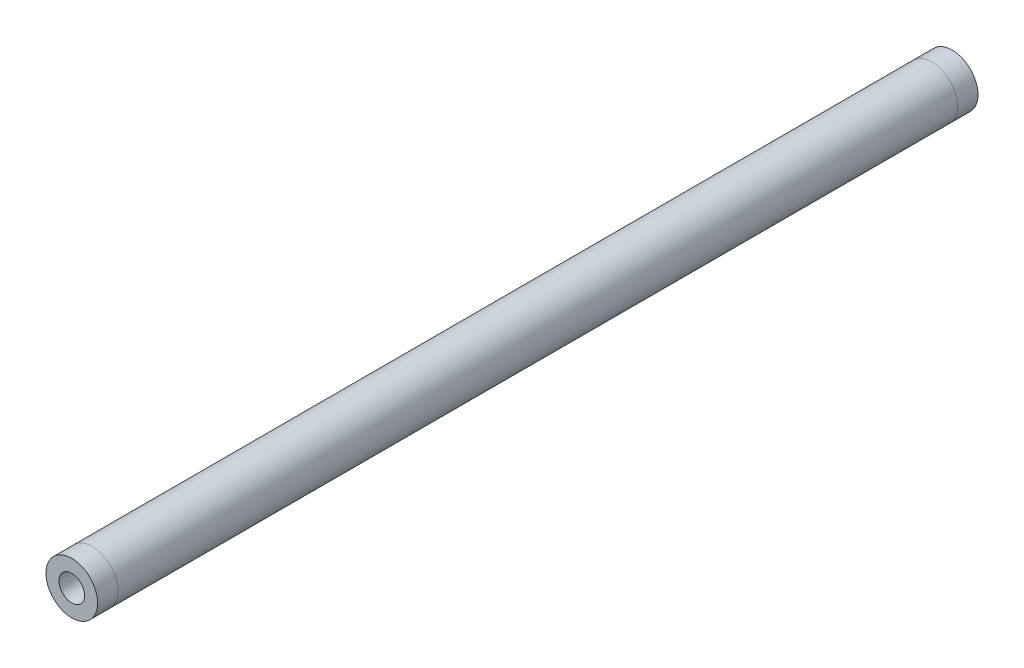
ISO-10303-21;
HEADER;
FILE_DESCRIPTION(('STEP AP214'),'2;1');
FILE_NAME('part.step','',(''),(''),'','','');
FILE_SCHEMA(('AUTOMOTIVE_DESIGN { 1 0 10303 214 1 1 1 1 }'));
ENDSEC;
DATA;
#1=APPLICATION_CONTEXT('core data for automotive mechanical design processes');
#2=APPLICATION_PROTOCOL_DEFINITION('international standard','automotive_design',2000,#1);
#3=PRODUCT_CONTEXT('',#1,'mechanical');
#4=PRODUCT('Part','Part','',(#3));
#5=PRODUCT_RELATED_PRODUCT_CATEGORY('part','',(#4));
#6=PRODUCT_DEFINITION_FORMATION('','',#4);
#7=PRODUCT_DEFINITION_CONTEXT('part definition',#1,'design');
#8=PRODUCT_DEFINITION('design','',#6,#7);
#9=PRODUCT_DEFINITION_SHAPE('','',#8);
#10=(LENGTH_UNIT() NAMED_UNIT(*) SI_UNIT(.MILLI.,.METRE.));
#11=(NAMED_UNIT(*) PLANE_ANGLE_UNIT() SI_UNIT($,.RADIAN.));
#12=(NAMED_UNIT(*) SI_UNIT($,.STERADIAN.) SOLID_ANGLE_UNIT());
#13=UNCERTAINTY_MEASURE_WITH_UNIT(LENGTH_MEASURE(1.E-05),#10,'distance_accuracy_value','');
#14=(GEOMETRIC_REPRESENTATION_CONTEXT(3) GLOBAL_UNCERTAINTY_ASSIGNED_CONTEXT((#13)) GLOBAL_UNIT_ASSIGNED_CONTEXT((#10,
#11,#12)) REPRESENTATION_CONTEXT('',''));
#15=CARTESIAN_POINT('',(0.,0.,0.));
#16=DIRECTION('',(0.,0.,1.));
#17=DIRECTION('',(1.,0.,0.));
#18=AXIS2_PLACEMENT_3D('',#15,#16,#17);
#19=CARTESIAN_POINT('',(0.,0.,-272.761985678966));
#20=DIRECTION('',(0.,0.,1.));
#21=DIRECTION('',(1.,0.,0.));
#22=AXIS2_PLACEMENT_3D('',#19,#20,#21);
#23=CYLINDRICAL_SURFACE('',#22,8.001);
#24=CARTESIAN_POINT('',(0.,0.,-272.761985678966));
#25=DIRECTION('',(0.,0.,1.));
#26=DIRECTION('',(1.,0.,0.));
#27=AXIS2_PLACEMENT_3D('',#24,#25,#26);
#28=CIRCLE('',#27,8.001);
#29=CARTESIAN_POINT('',(8.001,0.,-272.761985678966));
#30=VERTEX_POINT('',#29);
#31=EDGE_CURVE('E81',#30,#30,#28,.T.);
#32=ORIENTED_EDGE('',*,*,#31,.T.);
#33=EDGE_LOOP('',(#32));
#34=FACE_BOUND('',#33,.T.);
#35=CARTESIAN_POINT('',(0.,0.,-266.411985678966));
#36=DIRECTION('',(0.,0.,1.));
#37=DIRECTION('',(1.,0.,0.));
#38=AXIS2_PLACEMENT_3D('',#35,#36,#37);
#39=CIRCLE('',#38,8.001);
#40=CARTESIAN_POINT('',(8.001,0.,-266.411985678966));
#41=VERTEX_POINT('',#40);
#42=EDGE_CURVE('E77',#41,#41,#39,.T.);
#43=ORIENTED_EDGE('',*,*,#42,.F.);
#44=EDGE_LOOP('',(#43));
#45=FACE_BOUND('',#44,.T.);
#46=ADVANCED_FACE('F74',(#34,#45),#23,.T.);
#47=CARTESIAN_POINT('',(0.,0.,-272.761985678966));
#48=DIRECTION('',(0.,0.,1.));
#49=DIRECTION('',(1.,0.,0.));
#50=AXIS2_PLACEMENT_3D('',#47,#48,#49);
#51=PLANE('',#50);
#52=CARTESIAN_POINT('',(0.,0.,-272.761985678966));
#53=DIRECTION('',(0.,0.,1.));
#54=DIRECTION('',(1.,0.,0.));
#55=AXIS2_PLACEMENT_3D('',#52,#53,#54);
#56=CIRCLE('',#55,3.96875);
#57=CARTESIAN_POINT('',(3.96875,0.,-272.761985678966));
#58=VERTEX_POINT('',#57);
#59=EDGE_CURVE('E90',#58,#58,#56,.T.);
#60=ORIENTED_EDGE('',*,*,#59,.T.);
#61=EDGE_LOOP('',(#60));
#62=FACE_BOUND('',#61,.T.);
#63=ORIENTED_EDGE('',*,*,#31,.F.);
#64=EDGE_LOOP('',(#63));
#65=FACE_BOUND('',#64,.T.);
#66=ADVANCED_FACE('F117',(#62,#65),#51,.F.);
#67=CARTESIAN_POINT('',(0.,0.,-266.411985678966));
#68=DIRECTION('',(0.,0.,1.));
#69=DIRECTION('',(1.,0.,0.));
#70=AXIS2_PLACEMENT_3D('',#67,#68,#69);
#71=PLANE('',#70);
#72=CARTESIAN_POINT('',(0.,0.,-266.411985678966));
#73=DIRECTION('',(0.,0.,1.));
#74=DIRECTION('',(1.,0.,0.));
#75=AXIS2_PLACEMENT_3D('',#72,#73,#74);
#76=CIRCLE('',#75,6.477);
#77=CARTESIAN_POINT('',(-6.477,0.,-266.411985678966));
#78=VERTEX_POINT('',#77);
#79=EDGE_CURVE('E12',#78,#78,#76,.T.);
#80=ORIENTED_EDGE('',*,*,#79,.F.);
#81=EDGE_LOOP('',(#80));
#82=FACE_BOUND('',#81,.T.);
#83=ORIENTED_EDGE('',*,*,#42,.T.);
#84=EDGE_LOOP('',(#83));
#85=FACE_BOUND('',#84,.T.);
#86=ADVANCED_FACE('F113',(#82,#85),#71,.T.);
#87=CARTESIAN_POINT('',(0.,0.,-272.761985678966));
#88=DIRECTION('',(0.,0.,1.));
#89=DIRECTION('',(1.,0.,0.));
#90=AXIS2_PLACEMENT_3D('',#87,#88,#89);
#91=CYLINDRICAL_SURFACE('',#90,3.96875);
#92=ORIENTED_EDGE('',*,*,#59,.F.);
#93=EDGE_LOOP('',(#92));
#94=FACE_BOUND('',#93,.T.);
#95=CARTESIAN_POINT('',(0.,0.,-256.886985678966));
#96=DIRECTION('',(0.,0.,1.));
#97=DIRECTION('',(1.,0.,0.));
#98=AXIS2_PLACEMENT_3D('',#95,#96,#97);
#99=CIRCLE('',#98,3.96875);
#100=CARTESIAN_POINT('',(3.96875,0.,-256.886985678966));
#101=VERTEX_POINT('',#100);
#102=EDGE_CURVE('E96',#101,#101,#99,.T.);
#103=ORIENTED_EDGE('',*,*,#102,.T.);
#104=EDGE_LOOP('',(#103));
#105=FACE_BOUND('',#104,.T.);
#106=ADVANCED_FACE('F102',(#94,#105),#91,.F.);
#107=CARTESIAN_POINT('',(0.,0.,-256.886985678966));
#108=DIRECTION('',(0.,0.,1.));
#109=DIRECTION('',(1.,0.,0.));
#110=AXIS2_PLACEMENT_3D('',#107,#108,#109);
#111=PLANE('',#110);
#112=CARTESIAN_POINT('',(0.,0.,-256.886985678966));
#113=DIRECTION('',(0.,0.,1.));
#114=DIRECTION('',(1.,0.,0.));
#115=AXIS2_PLACEMENT_3D('',#112,#113,#114);
#116=CIRCLE('',#115,6.477);
#117=CARTESIAN_POINT('',(-6.477,0.,-256.886985678966));
#118=VERTEX_POINT('',#117);
#119=EDGE_CURVE('E88',#118,#118,#116,.T.);
#120=ORIENTED_EDGE('',*,*,#119,.T.);
#121=EDGE_LOOP('',(#120));
#122=FACE_BOUND('',#121,.T.);
#123=ORIENTED_EDGE('',*,*,#102,.F.);
#124=EDGE_LOOP('',(#123));
#125=FACE_BOUND('',#124,.T.);
#126=ADVANCED_FACE('F104',(#122,#125),#111,.T.);
#127=CARTESIAN_POINT('',(0.,0.,-256.886985678966));
#128=DIRECTION('',(0.,0.,-1.));
#129=DIRECTION('',(-1.,0.,0.));
#130=AXIS2_PLACEMENT_3D('',#127,#128,#129);
#131=CYLINDRICAL_SURFACE('',#130,6.477);
#132=CARTESIAN_POINT('',(-6.477,0.,-256.886985678966));
#133=CARTESIAN_POINT('',(-6.477,0.,-256.986204428966));
#134=CARTESIAN_POINT('',(-6.477,0.,-257.085423178966));
#135=CARTESIAN_POINT('',(-6.477,0.,-257.283860678966));
#136=CARTESIAN_POINT('',(-6.477,0.,-257.383079428966));
#137=CARTESIAN_POINT('',(-6.477,0.,-257.581516928966));
#138=CARTESIAN_POINT('',(-6.477,0.,-257.680735678966));
#139=CARTESIAN_POINT('',(-6.477,0.,-257.879173178966));
#140=CARTESIAN_POINT('',(-6.477,0.,-257.978391928966));
#141=CARTESIAN_POINT('',(-6.477,0.,-258.176829428966));
#142=CARTESIAN_POINT('',(-6.477,0.,-258.276048178966));
#143=CARTESIAN_POINT('',(-6.477,0.,-258.474485678966));
#144=CARTESIAN_POINT('',(-6.477,0.,-258.573704428966));
#145=CARTESIAN_POINT('',(-6.477,0.,-258.772141928966));
#146=CARTESIAN_POINT('',(-6.477,0.,-258.871360678966));
#147=CARTESIAN_POINT('',(-6.477,0.,-259.069798178966));
#148=CARTESIAN_POINT('',(-6.477,0.,-259.169016928966));
#149=CARTESIAN_POINT('',(-6.477,0.,-259.367454428966));
#150=CARTESIAN_POINT('',(-6.477,0.,-259.466673178966));
#151=CARTESIAN_POINT('',(-6.477,0.,-259.665110678966));
#152=CARTESIAN_POINT('',(-6.477,0.,-259.764329428966));
#153=CARTESIAN_POINT('',(-6.477,0.,-259.962766928966));
#154=CARTESIAN_POINT('',(-6.477,0.,-260.061985678966));
#155=CARTESIAN_POINT('',(-6.477,0.,-260.260423178966));
#156=CARTESIAN_POINT('',(-6.477,0.,-260.359641928966));
#157=CARTESIAN_POINT('',(-6.477,0.,-260.558079428966));
#158=CARTESIAN_POINT('',(-6.477,0.,-260.657298178966));
#159=CARTESIAN_POINT('',(-6.477,0.,-260.855735678966));
#160=CARTESIAN_POINT('',(-6.477,0.,-260.954954428966));
#161=CARTESIAN_POINT('',(-6.477,0.,-261.153391928966));
#162=CARTESIAN_POINT('',(-6.477,0.,-261.252610678966));
#163=CARTESIAN_POINT('',(-6.477,0.,-261.451048178966));
#164=CARTESIAN_POINT('',(-6.477,0.,-261.550266928966));
#165=CARTESIAN_POINT('',(-6.477,0.,-261.748704428966));
#166=CARTESIAN_POINT('',(-6.477,0.,-261.847923178966));
#167=CARTESIAN_POINT('',(-6.477,0.,-262.046360678966));
#168=CARTESIAN_POINT('',(-6.477,0.,-262.145579428966));
#169=CARTESIAN_POINT('',(-6.477,0.,-262.344016928966));
#170=CARTESIAN_POINT('',(-6.477,0.,-262.443235678966));
#171=CARTESIAN_POINT('',(-6.477,0.,-262.641673178966));
#172=CARTESIAN_POINT('',(-6.477,0.,-262.740891928966));
#173=CARTESIAN_POINT('',(-6.477,0.,-262.939329428966));
#174=CARTESIAN_POINT('',(-6.477,0.,-263.038548178966));
#175=CARTESIAN_POINT('',(-6.477,0.,-263.236985678966));
#176=CARTESIAN_POINT('',(-6.477,0.,-263.336204428966));
#177=CARTESIAN_POINT('',(-6.477,0.,-263.534641928966));
#178=CARTESIAN_POINT('',(-6.477,0.,-263.633860678966));
#179=CARTESIAN_POINT('',(-6.477,0.,-263.832298178966));
#180=CARTESIAN_POINT('',(-6.477,0.,-263.931516928966));
#181=CARTESIAN_POINT('',(-6.477,0.,-264.129954428966));
#182=CARTESIAN_POINT('',(-6.477,0.,-264.229173178966));
#183=CARTESIAN_POINT('',(-6.477,0.,-264.427610678966));
#184=CARTESIAN_POINT('',(-6.477,0.,-264.526829428966));
#185=CARTESIAN_POINT('',(-6.477,0.,-264.725266928966));
#186=CARTESIAN_POINT('',(-6.477,0.,-264.824485678966));
#187=CARTESIAN_POINT('',(-6.477,0.,-265.022923178966));
#188=CARTESIAN_POINT('',(-6.477,0.,-265.122141928966));
#189=CARTESIAN_POINT('',(-6.477,0.,-265.320579428966));
#190=CARTESIAN_POINT('',(-6.477,0.,-265.419798178966));
#191=CARTESIAN_POINT('',(-6.477,0.,-265.618235678966));
#192=CARTESIAN_POINT('',(-6.477,0.,-265.717454428966));
#193=CARTESIAN_POINT('',(-6.477,0.,-265.915891928966));
#194=CARTESIAN_POINT('',(-6.477,0.,-266.015110678966));
#195=CARTESIAN_POINT('',(-6.477,0.,-266.213548178966));
#196=CARTESIAN_POINT('',(-6.477,0.,-266.312766928966));
#197=CARTESIAN_POINT('',(-6.477,0.,-266.411985678966));
#198=B_SPLINE_CURVE_WITH_KNOTS('',3,(#132,#133,#134,#135,#136,#137,#138,#139,#140,#141,#142,
#143,#144,#145,#146,#147,#148,#149,#150,#151,#152,#153,#154,#155,#156,#157,#158,#159,#160,#161,
#162,#163,#164,#165,#166,#167,#168,#169,#170,#171,#172,#173,#174,#175,#176,#177,#178,#179,#180,
#181,#182,#183,#184,#185,#186,#187,#188,#189,#190,#191,#192,#193,#194,#195,#196,#197),
.UNSPECIFIED.,.F.,.F.,(4,2,2,2,2,2,2,2,2,2,2,2,2,2,2,2,2,2,2,2,2,2,2,2,2,2,2,2,2,2,2,2,4),(0.,
0.29765625,0.5953125,0.892968750000001,1.190625,1.48828125,1.7859375,2.08359375,2.38125,
2.67890625,2.9765625,3.27421875,3.571875,3.86953125,4.1671875,4.46484375,4.7625,5.06015625,
5.3578125,5.65546875,5.953125,6.25078125,6.5484375,6.84609375,7.14375,7.44140625,7.7390625,
8.03671875000001,8.334375,8.63203125,8.92968750000001,9.22734375000001,9.52500000000001),.UNSPECIFIED.);
#199=EDGE_CURVE('BSEAM106',#118,#78,#198,.T.);
#200=ORIENTED_EDGE('',*,*,#119,.F.);
#201=ORIENTED_EDGE('',*,*,#79,.T.);
#202=ORIENTED_EDGE('',*,*,#199,.T.);
#203=ORIENTED_EDGE('',*,*,#199,.F.);
#204=EDGE_LOOP('',(#200,#202,#201,#203));
#205=FACE_BOUND('',#204,.T.);
#206=ADVANCED_FACE('F106',(#205),#131,.T.);
#207=CLOSED_SHELL('',(#46,#66,#86,#106,#126,#206));
#208=MANIFOLD_SOLID_BREP('B2',#207);
#209=CARTESIAN_POINT('',(0.,0.,-266.411985678966));
#210=DIRECTION('',(0.,0.,1.));
#211=DIRECTION('',(1.,0.,0.));
#212=AXIS2_PLACEMENT_3D('',#209,#210,#211);
#213=CYLINDRICAL_SURFACE('',#212,8.001);
#214=CARTESIAN_POINT('',(0.,0.,-266.411985678966));
#215=DIRECTION('',(0.,0.,1.));
#216=DIRECTION('',(1.,0.,0.));
#217=AXIS2_PLACEMENT_3D('',#214,#215,#216);
#218=CIRCLE('',#217,8.001);
#219=CARTESIAN_POINT('',(8.001,0.,-266.411985678966));
#220=VERTEX_POINT('',#219);
#221=EDGE_CURVE('E73',#220,#220,#218,.T.);
#222=ORIENTED_EDGE('',*,*,#221,.T.);
#223=EDGE_LOOP('',(#222));
#224=FACE_BOUND('',#223,.T.);
#225=CARTESIAN_POINT('',(0.,0.,-6.35));
#226=DIRECTION('',(0.,0.,1.));
#227=DIRECTION('',(1.,0.,0.));
#228=AXIS2_PLACEMENT_3D('',#225,#226,#227);
#229=CIRCLE('',#228,8.001);
#230=CARTESIAN_POINT('',(8.001,0.,-6.35));
#231=VERTEX_POINT('',#230);
#232=EDGE_CURVE('E189',#231,#231,#229,.T.);
#233=ORIENTED_EDGE('',*,*,#232,.F.);
#234=EDGE_LOOP('',(#233));
#235=FACE_BOUND('',#234,.T.);
#236=ADVANCED_FACE('F186',(#224,#235),#213,.T.);
#237=CARTESIAN_POINT('',(0.,0.,-266.411985678966));
#238=DIRECTION('',(0.,0.,1.));
#239=DIRECTION('',(1.,0.,0.));
#240=AXIS2_PLACEMENT_3D('',#237,#238,#239);
#241=PLANE('',#240);
#242=CARTESIAN_POINT('',(0.,0.,-266.411985678966));
#243=DIRECTION('',(0.,0.,1.));
#244=DIRECTION('',(1.,0.,0.));
#245=AXIS2_PLACEMENT_3D('',#242,#243,#244);
#246=CIRCLE('',#245,6.477);
#247=CARTESIAN_POINT('',(6.477,0.,-266.411985678966));
#248=VERTEX_POINT('',#247);
#249=EDGE_CURVE('E196',#248,#248,#246,.T.);
#250=ORIENTED_EDGE('',*,*,#249,.T.);
#251=EDGE_LOOP('',(#250));
#252=FACE_BOUND('',#251,.T.);
#253=ORIENTED_EDGE('',*,*,#221,.F.);
#254=EDGE_LOOP('',(#253));
#255=FACE_BOUND('',#254,.T.);
#256=ADVANCED_FACE('F204',(#252,#255),#241,.F.);
#257=CARTESIAN_POINT('',(0.,0.,-6.35));
#258=DIRECTION('',(0.,0.,1.));
#259=DIRECTION('',(1.,0.,0.));
#260=AXIS2_PLACEMENT_3D('',#257,#258,#259);
#261=PLANE('',#260);
#262=CARTESIAN_POINT('',(0.,0.,-6.35));
#263=DIRECTION('',(0.,0.,1.));
#264=DIRECTION('',(1.,0.,0.));
#265=AXIS2_PLACEMENT_3D('',#262,#263,#264);
#266=CIRCLE('',#265,6.477);
#267=CARTESIAN_POINT('',(6.477,0.,-6.35));
#268=VERTEX_POINT('',#267);
#269=EDGE_CURVE('E198',#268,#268,#266,.T.);
#270=ORIENTED_EDGE('',*,*,#269,.F.);
#271=EDGE_LOOP('',(#270));
#272=FACE_BOUND('',#271,.T.);
#273=ORIENTED_EDGE('',*,*,#232,.T.);
#274=EDGE_LOOP('',(#273));
#275=FACE_BOUND('',#274,.T.);
#276=ADVANCED_FACE('F210',(#272,#275),#261,.T.);
#277=CARTESIAN_POINT('',(0.,0.,-266.411985678966));
#278=DIRECTION('',(0.,0.,1.));
#279=DIRECTION('',(1.,0.,0.));
#280=AXIS2_PLACEMENT_3D('',#277,#278,#279);
#281=CYLINDRICAL_SURFACE('',#280,6.477);
#282=ORIENTED_EDGE('',*,*,#249,.F.);
#283=EDGE_LOOP('',(#282));
#284=FACE_BOUND('',#283,.T.);
#285=ORIENTED_EDGE('',*,*,#269,.T.);
#286=EDGE_LOOP('',(#285));
#287=FACE_BOUND('',#286,.T.);
#288=ADVANCED_FACE('F207',(#284,#287),#281,.F.);
#289=CLOSED_SHELL('',(#236,#256,#276,#288));
#290=MANIFOLD_SOLID_BREP('B7',#289);
#291=CARTESIAN_POINT('',(0.,0.,-6.35));
#292=DIRECTION('',(0.,0.,1.));
#293=DIRECTION('',(1.,0.,0.));
#294=AXIS2_PLACEMENT_3D('',#291,#292,#293);
#295=CYLINDRICAL_SURFACE('',#294,8.001);
#296=CARTESIAN_POINT('',(0.,0.,-6.35));
#297=DIRECTION('',(0.,0.,1.));
#298=DIRECTION('',(1.,0.,0.));
#299=AXIS2_PLACEMENT_3D('',#296,#297,#298);
#300=CIRCLE('',#299,8.001);
#301=CARTESIAN_POINT('',(8.001,0.,-6.35));
#302=VERTEX_POINT('',#301);
#303=EDGE_CURVE('E185',#302,#302,#300,.T.);
#304=ORIENTED_EDGE('',*,*,#303,.T.);
#305=EDGE_LOOP('',(#304));
#306=FACE_BOUND('',#305,.T.);
#307=CARTESIAN_POINT('',(0.,0.,0.));
#308=DIRECTION('',(0.,0.,1.));
#309=DIRECTION('',(1.,0.,0.));
#310=AXIS2_PLACEMENT_3D('',#307,#308,#309);
#311=CIRCLE('',#310,8.001);
#312=CARTESIAN_POINT('',(8.001,0.,0.));
#313=VERTEX_POINT('',#312);
#314=EDGE_CURVE('E259',#313,#313,#311,.T.);
#315=ORIENTED_EDGE('',*,*,#314,.F.);
#316=EDGE_LOOP('',(#315));
#317=FACE_BOUND('',#316,.T.);
#318=ADVANCED_FACE('F248',(#306,#317),#295,.T.);
#319=CARTESIAN_POINT('',(0.,0.,-6.35));
#320=DIRECTION('',(0.,0.,1.));
#321=DIRECTION('',(1.,0.,0.));
#322=AXIS2_PLACEMENT_3D('',#319,#320,#321);
#323=CYLINDRICAL_SURFACE('',#322,3.96875);
#324=CARTESIAN_POINT('',(0.,0.,0.));
#325=DIRECTION('',(0.,0.,1.));
#326=DIRECTION('',(1.,0.,0.));
#327=AXIS2_PLACEMENT_3D('',#324,#325,#326);
#328=CIRCLE('',#327,3.96875);
#329=CARTESIAN_POINT('',(3.96875,0.,0.));
#330=VERTEX_POINT('',#329);
#331=EDGE_CURVE('E251',#330,#330,#328,.T.);
#332=ORIENTED_EDGE('',*,*,#331,.T.);
#333=EDGE_LOOP('',(#332));
#334=FACE_BOUND('',#333,.T.);
#335=CARTESIAN_POINT('',(0.,0.,-15.875));
#336=DIRECTION('',(0.,0.,1.));
#337=DIRECTION('',(1.,0.,0.));
#338=AXIS2_PLACEMENT_3D('',#335,#336,#337);
#339=CIRCLE('',#338,3.96875);
#340=CARTESIAN_POINT('',(3.96875,0.,-15.875));
#341=VERTEX_POINT('',#340);
#342=EDGE_CURVE('E271',#341,#341,#339,.T.);
#343=ORIENTED_EDGE('',*,*,#342,.F.);
#344=EDGE_LOOP('',(#343));
#345=FACE_BOUND('',#344,.T.);
#346=ADVANCED_FACE('F279',(#334,#345),#323,.F.);
#347=CARTESIAN_POINT('',(0.,0.,-6.35));
#348=DIRECTION('',(0.,0.,1.));
#349=DIRECTION('',(1.,0.,0.));
#350=AXIS2_PLACEMENT_3D('',#347,#348,#349);
#351=PLANE('',#350);
#352=CARTESIAN_POINT('',(0.,0.,-6.35));
#353=DIRECTION('',(0.,0.,1.));
#354=DIRECTION('',(1.,0.,0.));
#355=AXIS2_PLACEMENT_3D('',#352,#353,#354);
#356=CIRCLE('',#355,6.477);
#357=CARTESIAN_POINT('',(6.477,0.,-6.35));
#358=VERTEX_POINT('',#357);
#359=EDGE_CURVE('E261',#358,#358,#356,.T.);
#360=ORIENTED_EDGE('',*,*,#359,.T.);
#361=EDGE_LOOP('',(#360));
#362=FACE_BOUND('',#361,.T.);
#363=ORIENTED_EDGE('',*,*,#303,.F.);
#364=EDGE_LOOP('',(#363));
#365=FACE_BOUND('',#364,.T.);
#366=ADVANCED_FACE('F281',(#362,#365),#351,.F.);
#367=CARTESIAN_POINT('',(0.,0.,0.));
#368=DIRECTION('',(0.,0.,1.));
#369=DIRECTION('',(1.,0.,0.));
#370=AXIS2_PLACEMENT_3D('',#367,#368,#369);
#371=PLANE('',#370);
#372=ORIENTED_EDGE('',*,*,#314,.T.);
#373=EDGE_LOOP('',(#372));
#374=FACE_BOUND('',#373,.T.);
#375=ORIENTED_EDGE('',*,*,#331,.F.);
#376=EDGE_LOOP('',(#375));
#377=FACE_BOUND('',#376,.T.);
#378=ADVANCED_FACE('F287',(#374,#377),#371,.T.);
#379=CARTESIAN_POINT('',(0.,0.,-15.875));
#380=DIRECTION('',(0.,0.,1.));
#381=DIRECTION('',(1.,0.,0.));
#382=AXIS2_PLACEMENT_3D('',#379,#380,#381);
#383=CYLINDRICAL_SURFACE('',#382,6.477);
#384=CARTESIAN_POINT('',(0.,0.,-15.875));
#385=DIRECTION('',(0.,0.,1.));
#386=DIRECTION('',(1.,0.,0.));
#387=AXIS2_PLACEMENT_3D('',#384,#385,#386);
#388=CIRCLE('',#387,6.477);
#389=CARTESIAN_POINT('',(6.477,0.,-15.875));
#390=VERTEX_POINT('',#389);
#391=EDGE_CURVE('E264',#390,#390,#388,.T.);
#392=CARTESIAN_POINT('',(6.477,0.,-15.875));
#393=CARTESIAN_POINT('',(6.477,0.,-15.77578125));
#394=CARTESIAN_POINT('',(6.477,0.,-15.6765625));
#395=CARTESIAN_POINT('',(6.477,0.,-15.478125));
#396=CARTESIAN_POINT('',(6.477,0.,-15.37890625));
#397=CARTESIAN_POINT('',(6.477,0.,-15.18046875));
#398=CARTESIAN_POINT('',(6.477,0.,-15.08125));
#399=CARTESIAN_POINT('',(6.477,0.,-14.8828125));
#400=CARTESIAN_POINT('',(6.477,0.,-14.78359375));
#401=CARTESIAN_POINT('',(6.477,0.,-14.58515625));
#402=CARTESIAN_POINT('',(6.477,0.,-14.4859375));
#403=CARTESIAN_POINT('',(6.477,0.,-14.2875));
#404=CARTESIAN_POINT('',(6.477,0.,-14.18828125));
#405=CARTESIAN_POINT('',(6.477,0.,-13.98984375));
#406=CARTESIAN_POINT('',(6.477,0.,-13.890625));
#407=CARTESIAN_POINT('',(6.477,0.,-13.6921875));
#408=CARTESIAN_POINT('',(6.477,0.,-13.59296875));
#409=CARTESIAN_POINT('',(6.477,0.,-13.39453125));
#410=CARTESIAN_POINT('',(6.477,0.,-13.2953125));
#411=CARTESIAN_POINT('',(6.477,0.,-13.096875));
#412=CARTESIAN_POINT('',(6.477,0.,-12.99765625));
#413=CARTESIAN_POINT('',(6.477,0.,-12.79921875));
#414=CARTESIAN_POINT('',(6.477,0.,-12.7));
#415=CARTESIAN_POINT('',(6.477,0.,-12.5015625));
#416=CARTESIAN_POINT('',(6.477,0.,-12.40234375));
#417=CARTESIAN_POINT('',(6.477,0.,-12.20390625));
#418=CARTESIAN_POINT('',(6.477,0.,-12.1046875));
#419=CARTESIAN_POINT('',(6.477,0.,-11.90625));
#420=CARTESIAN_POINT('',(6.477,0.,-11.80703125));
#421=CARTESIAN_POINT('',(6.477,0.,-11.60859375));
#422=CARTESIAN_POINT('',(6.477,0.,-11.509375));
#423=CARTESIAN_POINT('',(6.477,0.,-11.3109375));
#424=CARTESIAN_POINT('',(6.477,0.,-11.21171875));
#425=CARTESIAN_POINT('',(6.477,0.,-11.01328125));
#426=CARTESIAN_POINT('',(6.477,0.,-10.9140625));
#427=CARTESIAN_POINT('',(6.477,0.,-10.715625));
#428=CARTESIAN_POINT('',(6.477,0.,-10.61640625));
#429=CARTESIAN_POINT('',(6.477,0.,-10.41796875));
#430=CARTESIAN_POINT('',(6.477,0.,-10.31875));
#431=CARTESIAN_POINT('',(6.477,0.,-10.1203125));
#432=CARTESIAN_POINT('',(6.477,0.,-10.02109375));
#433=CARTESIAN_POINT('',(6.477,0.,-9.82265625));
#434=CARTESIAN_POINT('',(6.477,0.,-9.7234375));
#435=CARTESIAN_POINT('',(6.477,0.,-9.525));
#436=CARTESIAN_POINT('',(6.477,0.,-9.42578125));
#437=CARTESIAN_POINT('',(6.477,0.,-9.22734375));
#438=CARTESIAN_POINT('',(6.477,0.,-9.128125));
#439=CARTESIAN_POINT('',(6.477,0.,-8.9296875));
#440=CARTESIAN_POINT('',(6.477,0.,-8.83046875));
#441=CARTESIAN_POINT('',(6.477,0.,-8.63203125));
#442=CARTESIAN_POINT('',(6.477,0.,-8.5328125));
#443=CARTESIAN_POINT('',(6.477,0.,-8.334375));
#444=CARTESIAN_POINT('',(6.477,0.,-8.23515625));
#445=CARTESIAN_POINT('',(6.477,0.,-8.03671875));
#446=CARTESIAN_POINT('',(6.477,0.,-7.9375));
#447=CARTESIAN_POINT('',(6.477,0.,-7.7390625));
#448=CARTESIAN_POINT('',(6.477,0.,-7.63984375));
#449=CARTESIAN_POINT('',(6.477,0.,-7.44140625));
#450=CARTESIAN_POINT('',(6.477,0.,-7.3421875));
#451=CARTESIAN_POINT('',(6.477,0.,-7.14375));
#452=CARTESIAN_POINT('',(6.477,0.,-7.04453125));
#453=CARTESIAN_POINT('',(6.477,0.,-6.84609375));
#454=CARTESIAN_POINT('',(6.477,0.,-6.746875));
#455=CARTESIAN_POINT('',(6.477,0.,-6.5484375));
#456=CARTESIAN_POINT('',(6.477,0.,-6.44921875));
#457=CARTESIAN_POINT('',(6.477,0.,-6.35));
#458=B_SPLINE_CURVE_WITH_KNOTS('',3,(#392,#393,#394,#395,#396,#397,#398,#399,#400,#401,#402,
#403,#404,#405,#406,#407,#408,#409,#410,#411,#412,#413,#414,#415,#416,#417,#418,#419,#420,#421,
#422,#423,#424,#425,#426,#427,#428,#429,#430,#431,#432,#433,#434,#435,#436,#437,#438,#439,#440,
#441,#442,#443,#444,#445,#446,#447,#448,#449,#450,#451,#452,#453,#454,#455,#456,#457),
.UNSPECIFIED.,.F.,.F.,(4,2,2,2,2,2,2,2,2,2,2,2,2,2,2,2,2,2,2,2,2,2,2,2,2,2,2,2,2,2,2,2,4),(0.,
0.297656250000002,0.595312500000002,0.892968750000002,1.190625,1.48828125,1.7859375,2.08359375,
2.38125,2.67890625,2.9765625,3.27421875,3.571875,3.86953125,4.1671875,4.46484375,4.7625,
5.06015625,5.3578125,5.65546875,5.953125,6.25078125,6.5484375,6.84609375,7.14375,7.44140625,
7.7390625,8.03671875,8.334375,8.63203125,8.9296875,9.22734375,9.525),.UNSPECIFIED.);
#459=EDGE_CURVE('BSEAM292',#390,#358,#458,.T.);
#460=ORIENTED_EDGE('',*,*,#391,.T.);
#461=ORIENTED_EDGE('',*,*,#359,.F.);
#462=ORIENTED_EDGE('',*,*,#459,.T.);
#463=ORIENTED_EDGE('',*,*,#459,.F.);
#464=EDGE_LOOP('',(#460,#462,#461,#463));
#465=FACE_BOUND('',#464,.T.);
#466=ADVANCED_FACE('F292',(#465),#383,.T.);
#467=CARTESIAN_POINT('',(0.,0.,-15.875));
#468=DIRECTION('',(0.,0.,1.));
#469=DIRECTION('',(1.,0.,0.));
#470=AXIS2_PLACEMENT_3D('',#467,#468,#469);
#471=PLANE('',#470);
#472=ORIENTED_EDGE('',*,*,#342,.T.);
#473=EDGE_LOOP('',(#472));
#474=FACE_BOUND('',#473,.T.);
#475=ORIENTED_EDGE('',*,*,#391,.F.);
#476=EDGE_LOOP('',(#475));
#477=FACE_BOUND('',#476,.T.);
#478=ADVANCED_FACE('F276',(#474,#477),#471,.F.);
#479=CLOSED_SHELL('',(#318,#346,#366,#378,#466,#478));
#480=MANIFOLD_SOLID_BREP('B68',#479);
#481=ADVANCED_BREP_SHAPE_REPRESENTATION('',(#18,#208,#290,#480),#14);
#482=SHAPE_DEFINITION_REPRESENTATION(#9,#481);
ENDSEC;
END-ISO-10303-21;
